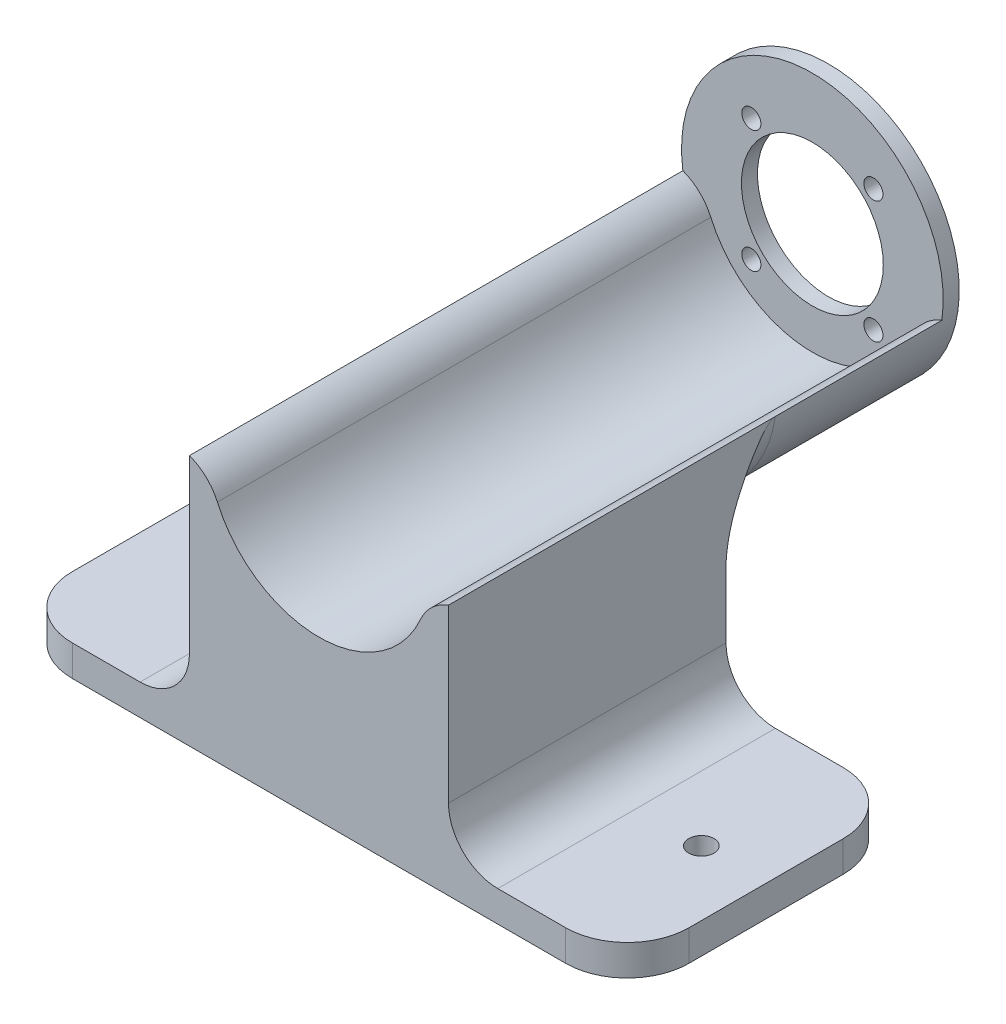
ISO-10303-21;
HEADER;
FILE_DESCRIPTION(('STEP AP214'),'2;1');
FILE_NAME('part.step','',(''),(''),'','','');
FILE_SCHEMA(('AUTOMOTIVE_DESIGN { 1 0 10303 214 1 1 1 1 }'));
ENDSEC;
DATA;
#1=APPLICATION_CONTEXT('core data for automotive mechanical design processes');
#2=APPLICATION_PROTOCOL_DEFINITION('international standard','automotive_design',2000,#1);
#3=PRODUCT_CONTEXT('',#1,'mechanical');
#4=PRODUCT('Part','Part','',(#3));
#5=PRODUCT_RELATED_PRODUCT_CATEGORY('part','',(#4));
#6=PRODUCT_DEFINITION_FORMATION('','',#4);
#7=PRODUCT_DEFINITION_CONTEXT('part definition',#1,'design');
#8=PRODUCT_DEFINITION('design','',#6,#7);
#9=PRODUCT_DEFINITION_SHAPE('','',#8);
#10=(LENGTH_UNIT() NAMED_UNIT(*) SI_UNIT(.MILLI.,.METRE.));
#11=(NAMED_UNIT(*) PLANE_ANGLE_UNIT() SI_UNIT($,.RADIAN.));
#12=(NAMED_UNIT(*) SI_UNIT($,.STERADIAN.) SOLID_ANGLE_UNIT());
#13=UNCERTAINTY_MEASURE_WITH_UNIT(LENGTH_MEASURE(1.E-05),#10,'distance_accuracy_value','');
#14=(GEOMETRIC_REPRESENTATION_CONTEXT(3) GLOBAL_UNCERTAINTY_ASSIGNED_CONTEXT((#13)) GLOBAL_UNIT_ASSIGNED_CONTEXT((#10,
#11,#12)) REPRESENTATION_CONTEXT('',''));
#15=CARTESIAN_POINT('',(0.,0.,0.));
#16=DIRECTION('',(0.,0.,1.));
#17=DIRECTION('',(1.,0.,0.));
#18=AXIS2_PLACEMENT_3D('',#15,#16,#17);
#19=CARTESIAN_POINT('',(9.9,51.1989898474541,-37.6));
#20=DIRECTION('',(0.,0.,1.));
#21=DIRECTION('',(1.,0.,0.));
#22=AXIS2_PLACEMENT_3D('',#19,#20,#21);
#23=CYLINDRICAL_SURFACE('',#22,1.55);
#24=CARTESIAN_POINT('',(9.9,51.1989898474541,-37.6));
#25=DIRECTION('',(0.,0.,-1.));
#26=DIRECTION('',(-1.,0.,0.));
#27=AXIS2_PLACEMENT_3D('',#24,#25,#26);
#28=CIRCLE('',#27,1.55);
#29=CARTESIAN_POINT('',(8.35,51.1989898474541,-37.6));
#30=VERTEX_POINT('',#29);
#31=EDGE_CURVE('E532',#30,#30,#28,.T.);
#32=ORIENTED_EDGE('',*,*,#31,.T.);
#33=EDGE_LOOP('',(#32));
#34=FACE_BOUND('',#33,.T.);
#35=CARTESIAN_POINT('',(9.9,51.1989898474541,-35.));
#36=DIRECTION('',(0.,0.,1.));
#37=DIRECTION('',(1.,0.,0.));
#38=AXIS2_PLACEMENT_3D('',#35,#36,#37);
#39=CIRCLE('',#38,1.55);
#40=CARTESIAN_POINT('',(11.45,51.1989898474541,-35.));
#41=VERTEX_POINT('',#40);
#42=EDGE_CURVE('E203',#41,#41,#39,.T.);
#43=ORIENTED_EDGE('',*,*,#42,.T.);
#44=EDGE_LOOP('',(#43));
#45=FACE_BOUND('',#44,.T.);
#46=ADVANCED_FACE('F41',(#34,#45),#23,.F.);
#47=CARTESIAN_POINT('',(-9.90000000000001,51.1989898474541,-37.6));
#48=DIRECTION('',(0.,0.,1.));
#49=DIRECTION('',(1.,0.,0.));
#50=AXIS2_PLACEMENT_3D('',#47,#48,#49);
#51=CYLINDRICAL_SURFACE('',#50,1.55);
#52=CARTESIAN_POINT('',(-9.90000000000001,51.1989898474541,-37.6));
#53=DIRECTION('',(0.,0.,-1.));
#54=DIRECTION('',(-1.,0.,0.));
#55=AXIS2_PLACEMENT_3D('',#52,#53,#54);
#56=CIRCLE('',#55,1.55);
#57=CARTESIAN_POINT('',(-11.45,51.1989898474541,-37.6));
#58=VERTEX_POINT('',#57);
#59=EDGE_CURVE('E536',#58,#58,#56,.T.);
#60=ORIENTED_EDGE('',*,*,#59,.T.);
#61=EDGE_LOOP('',(#60));
#62=FACE_BOUND('',#61,.T.);
#63=CARTESIAN_POINT('',(-9.90000000000001,51.1989898474541,-35.));
#64=DIRECTION('',(0.,0.,1.));
#65=DIRECTION('',(1.,0.,0.));
#66=AXIS2_PLACEMENT_3D('',#63,#64,#65);
#67=CIRCLE('',#66,1.55);
#68=CARTESIAN_POINT('',(-8.35,51.1989898474541,-35.));
#69=VERTEX_POINT('',#68);
#70=EDGE_CURVE('E552',#69,#69,#67,.T.);
#71=ORIENTED_EDGE('',*,*,#70,.T.);
#72=EDGE_LOOP('',(#71));
#73=FACE_BOUND('',#72,.T.);
#74=ADVANCED_FACE('F278',(#62,#73),#51,.F.);
#75=CARTESIAN_POINT('',(-9.90000000000001,31.3989898474541,-37.6));
#76=DIRECTION('',(0.,0.,1.));
#77=DIRECTION('',(1.,0.,0.));
#78=AXIS2_PLACEMENT_3D('',#75,#76,#77);
#79=CYLINDRICAL_SURFACE('',#78,1.55);
#80=CARTESIAN_POINT('',(-9.90000000000001,31.3989898474541,-37.6));
#81=DIRECTION('',(0.,0.,-1.));
#82=DIRECTION('',(-1.,0.,0.));
#83=AXIS2_PLACEMENT_3D('',#80,#81,#82);
#84=CIRCLE('',#83,1.55);
#85=CARTESIAN_POINT('',(-11.45,31.3989898474541,-37.6));
#86=VERTEX_POINT('',#85);
#87=EDGE_CURVE('E540',#86,#86,#84,.T.);
#88=ORIENTED_EDGE('',*,*,#87,.T.);
#89=EDGE_LOOP('',(#88));
#90=FACE_BOUND('',#89,.T.);
#91=CARTESIAN_POINT('',(-9.90000000000001,31.3989898474541,-35.));
#92=DIRECTION('',(0.,0.,1.));
#93=DIRECTION('',(1.,0.,0.));
#94=AXIS2_PLACEMENT_3D('',#91,#92,#93);
#95=CIRCLE('',#94,1.55);
#96=CARTESIAN_POINT('',(-8.35000000000001,31.3989898474541,-35.));
#97=VERTEX_POINT('',#96);
#98=EDGE_CURVE('E388',#97,#97,#95,.T.);
#99=ORIENTED_EDGE('',*,*,#98,.T.);
#100=EDGE_LOOP('',(#99));
#101=FACE_BOUND('',#100,.T.);
#102=ADVANCED_FACE('F284',(#90,#101),#79,.F.);
#103=CARTESIAN_POINT('',(9.9,31.3989898474541,-37.6));
#104=DIRECTION('',(0.,0.,1.));
#105=DIRECTION('',(1.,0.,0.));
#106=AXIS2_PLACEMENT_3D('',#103,#104,#105);
#107=CYLINDRICAL_SURFACE('',#106,1.55);
#108=CARTESIAN_POINT('',(9.9,31.3989898474541,-37.6));
#109=DIRECTION('',(0.,0.,-1.));
#110=DIRECTION('',(-1.,0.,0.));
#111=AXIS2_PLACEMENT_3D('',#108,#109,#110);
#112=CIRCLE('',#111,1.55);
#113=CARTESIAN_POINT('',(8.35,31.3989898474541,-37.6));
#114=VERTEX_POINT('',#113);
#115=EDGE_CURVE('E202',#114,#114,#112,.T.);
#116=ORIENTED_EDGE('',*,*,#115,.T.);
#117=EDGE_LOOP('',(#116));
#118=FACE_BOUND('',#117,.T.);
#119=CARTESIAN_POINT('',(9.9,31.3989898474541,-35.));
#120=DIRECTION('',(0.,0.,1.));
#121=DIRECTION('',(1.,0.,0.));
#122=AXIS2_PLACEMENT_3D('',#119,#120,#121);
#123=CIRCLE('',#122,1.55);
#124=CARTESIAN_POINT('',(11.45,31.3989898474541,-35.));
#125=VERTEX_POINT('',#124);
#126=EDGE_CURVE('E385',#125,#125,#123,.T.);
#127=ORIENTED_EDGE('',*,*,#126,.T.);
#128=EDGE_LOOP('',(#127));
#129=FACE_BOUND('',#128,.T.);
#130=ADVANCED_FACE('F241',(#118,#129),#107,.F.);
#131=CARTESIAN_POINT('',(21.,2.5,45.));
#132=DIRECTION('',(0.,-1.,0.));
#133=DIRECTION('',(0.,0.,-1.));
#134=AXIS2_PLACEMENT_3D('',#131,#132,#133);
#135=PLANE('',#134);
#136=CARTESIAN_POINT('',(39.5,2.5,22.5));
#137=DIRECTION('',(0.,1.,0.));
#138=DIRECTION('',(0.,0.,-1.));
#139=AXIS2_PLACEMENT_3D('',#136,#137,#138);
#140=CIRCLE('',#139,2.05);
#141=CARTESIAN_POINT('',(39.5,2.5,20.45));
#142=VERTEX_POINT('',#141);
#143=EDGE_CURVE('E497',#142,#142,#140,.T.);
#144=ORIENTED_EDGE('',*,*,#143,.F.);
#145=EDGE_LOOP('',(#144));
#146=FACE_BOUND('',#145,.T.);
#147=DIRECTION('',(-1.,0.,0.));
#148=VECTOR('',#147,1.);
#149=CARTESIAN_POINT('',(21.,2.5,0.));
#150=LINE('',#149,#148);
#151=CARTESIAN_POINT('',(40.,2.5,0.));
#152=VERTEX_POINT('',#151);
#153=CARTESIAN_POINT('',(29.,2.5,0.));
#154=VERTEX_POINT('',#153);
#155=EDGE_CURVE('E424',#152,#154,#150,.T.);
#156=ORIENTED_EDGE('',*,*,#155,.T.);
#157=DIRECTION('',(0.,0.,-1.));
#158=VECTOR('',#157,1.);
#159=CARTESIAN_POINT('',(29.,2.5,45.));
#160=LINE('',#159,#158);
#161=CARTESIAN_POINT('',(29.,2.5,45.));
#162=VERTEX_POINT('',#161);
#163=EDGE_CURVE('E363',#154,#162,#160,.F.);
#164=ORIENTED_EDGE('',*,*,#163,.T.);
#165=DIRECTION('',(-1.,0.,0.));
#166=VECTOR('',#165,1.);
#167=CARTESIAN_POINT('',(21.,2.5,45.));
#168=LINE('',#167,#166);
#169=CARTESIAN_POINT('',(40.,2.5,45.));
#170=VERTEX_POINT('',#169);
#171=EDGE_CURVE('E431',#170,#162,#168,.T.);
#172=ORIENTED_EDGE('',*,*,#171,.F.);
#173=CARTESIAN_POINT('',(40.,2.5,35.));
#174=DIRECTION('',(0.,-1.,0.));
#175=DIRECTION('',(0.,0.,-1.));
#176=AXIS2_PLACEMENT_3D('',#173,#174,#175);
#177=CIRCLE('',#176,10.);
#178=CARTESIAN_POINT('',(50.,2.5,35.));
#179=VERTEX_POINT('',#178);
#180=EDGE_CURVE('E453',#170,#179,#177,.F.);
#181=ORIENTED_EDGE('',*,*,#180,.T.);
#182=DIRECTION('',(0.,0.,-1.));
#183=VECTOR('',#182,1.);
#184=CARTESIAN_POINT('',(50.,2.5,45.));
#185=LINE('',#184,#183);
#186=CARTESIAN_POINT('',(50.,2.5,10.));
#187=VERTEX_POINT('',#186);
#188=EDGE_CURVE('E432',#179,#187,#185,.T.);
#189=ORIENTED_EDGE('',*,*,#188,.T.);
#190=CARTESIAN_POINT('',(40.,2.5,10.));
#191=DIRECTION('',(0.,-1.,0.));
#192=DIRECTION('',(0.,0.,-1.));
#193=AXIS2_PLACEMENT_3D('',#190,#191,#192);
#194=CIRCLE('',#193,10.);
#195=EDGE_CURVE('E456',#187,#152,#194,.F.);
#196=ORIENTED_EDGE('',*,*,#195,.T.);
#197=EDGE_LOOP('',(#156,#164,#172,#181,#189,#196));
#198=FACE_BOUND('',#197,.T.);
#199=ADVANCED_FACE('F237',(#146,#198),#135,.F.);
#200=CARTESIAN_POINT('',(21.,38.3,45.));
#201=DIRECTION('',(-1.,0.,0.));
#202=DIRECTION('',(0.,-1.,0.));
#203=AXIS2_PLACEMENT_3D('',#200,#201,#202);
#204=PLANE('',#203);
#205=DIRECTION('',(0.,1.,0.));
#206=VECTOR('',#205,1.);
#207=CARTESIAN_POINT('',(21.,38.3,45.));
#208=LINE('',#207,#206);
#209=CARTESIAN_POINT('',(21.,10.5,45.));
#210=VERTEX_POINT('',#209);
#211=CARTESIAN_POINT('',(21.,38.3,45.));
#212=VERTEX_POINT('',#211);
#213=EDGE_CURVE('E404',#210,#212,#208,.T.);
#214=ORIENTED_EDGE('',*,*,#213,.F.);
#215=DIRECTION('',(0.,0.,-1.));
#216=VECTOR('',#215,1.);
#217=CARTESIAN_POINT('',(21.,10.5,0.));
#218=LINE('',#217,#216);
#219=CARTESIAN_POINT('',(21.,10.5,0.));
#220=VERTEX_POINT('',#219);
#221=EDGE_CURVE('E359',#210,#220,#218,.T.);
#222=ORIENTED_EDGE('',*,*,#221,.T.);
#223=DIRECTION('',(0.,1.,0.));
#224=VECTOR('',#223,1.);
#225=CARTESIAN_POINT('',(21.,38.3,0.));
#226=LINE('',#225,#224);
#227=CARTESIAN_POINT('',(21.,20.9920888575525,0.));
#228=VERTEX_POINT('',#227);
#229=EDGE_CURVE('E412',#220,#228,#226,.T.);
#230=ORIENTED_EDGE('',*,*,#229,.T.);
#231=CARTESIAN_POINT('',(21.,20.9920888575525,0.));
#232=CARTESIAN_POINT('',(21.,21.2623409261324,-6.71861428184681E-06));
#233=CARTESIAN_POINT('',(21.,21.5325275202442,-0.00661704058536909));
#234=CARTESIAN_POINT('',(21.,22.0722317970235,-0.0322618663273328));
#235=CARTESIAN_POINT('',(21.,22.3417496620315,-0.0512924945656515));
#236=CARTESIAN_POINT('',(21.,23.147717395016,-0.125752491028399));
#237=CARTESIAN_POINT('',(21.,23.6826185956186,-0.198556053612414));
#238=CARTESIAN_POINT('',(21.,24.7442450465604,-0.384595417943144));
#239=CARTESIAN_POINT('',(21.,25.2709819497984,-0.497766714324408));
#240=CARTESIAN_POINT('',(21.,26.3157953901878,-0.759484195902259));
#241=CARTESIAN_POINT('',(21.,26.8338677402384,-0.908046983731396));
#242=CARTESIAN_POINT('',(21.,27.7165912449188,-1.19012251426909));
#243=CARTESIAN_POINT('',(21.,28.0836452323154,-1.31623276224073));
#244=CARTESIAN_POINT('',(21.,28.8124454857969,-1.58296288509404));
#245=CARTESIAN_POINT('',(21.,29.1741916936457,-1.72358291903872));
#246=CARTESIAN_POINT('',(21.,29.8924872145569,-2.01810446595665));
#247=CARTESIAN_POINT('',(21.,30.2490330630773,-2.17201439915696));
#248=CARTESIAN_POINT('',(21.,30.9566303944847,-2.49191991078786));
#249=CARTESIAN_POINT('',(21.,31.3076821363394,-2.65791491748486));
#250=CARTESIAN_POINT('',(21.,32.0041355626901,-3.00107787409831));
#251=CARTESIAN_POINT('',(21.,32.3495390195583,-3.17824223104802));
#252=CARTESIAN_POINT('',(21.,33.0346714898339,-3.54329852451233));
#253=CARTESIAN_POINT('',(21.,33.3743998901954,-3.73119161043082));
#254=CARTESIAN_POINT('',(21.,34.0474288293915,-4.11753368676009));
#255=CARTESIAN_POINT('',(21.,34.380734741634,-4.31597327985377));
#256=CARTESIAN_POINT('',(21.,34.8751733043352,-4.62244912915646));
#257=CARTESIAN_POINT('',(21.,35.0390527208008,-4.72606818010602));
#258=CARTESIAN_POINT('',(21.,35.3646921479181,-4.93657973434685));
#259=CARTESIAN_POINT('',(21.,35.5264522683963,-5.04347206704386));
#260=CARTESIAN_POINT('',(21.,35.7907084150292,-5.22261514762113));
#261=CARTESIAN_POINT('',(21.,35.8939524830505,-5.29376317336676));
#262=CARTESIAN_POINT('',(21.,36.0991798109869,-5.437863857316));
#263=CARTESIAN_POINT('',(21.,36.2011630434743,-5.51081655467476));
#264=CARTESIAN_POINT('',(21.,36.4037276822896,-5.6589082938422));
#265=CARTESIAN_POINT('',(21.,36.5043071894743,-5.73404993947667));
#266=CARTESIAN_POINT('',(21.,36.7035336167251,-5.88683736377596));
#267=CARTESIAN_POINT('',(21.,36.8021807801776,-5.96448282377288));
#268=CARTESIAN_POINT('',(21.,36.9921317414153,-6.11895236583142));
#269=CARTESIAN_POINT('',(21.,37.0835571239362,-6.19562628525305));
#270=CARTESIAN_POINT('',(21.,37.2633235468887,-6.35250107066562));
#271=CARTESIAN_POINT('',(21.,37.3516652092276,-6.43270121804817));
#272=CARTESIAN_POINT('',(21.,37.5239262991856,-6.59765902437491));
#273=CARTESIAN_POINT('',(21.,37.607848304476,-6.68241396721882));
#274=CARTESIAN_POINT('',(21.,37.7690197278868,-6.85798231932057));
#275=CARTESIAN_POINT('',(21.,37.8462780503733,-6.94878734706603));
#276=CARTESIAN_POINT('',(21.,37.9736132494437,-7.1169665429816));
#277=CARTESIAN_POINT('',(21.,38.0258658884497,-7.19266381049547));
#278=CARTESIAN_POINT('',(21.,38.1203384004898,-7.34952721477898));
#279=CARTESIAN_POINT('',(21.,38.1626272641338,-7.43065043036103));
#280=CARTESIAN_POINT('',(21.,38.2292092461585,-7.59097093670216));
#281=CARTESIAN_POINT('',(21.,38.2548636670585,-7.66957227889538));
#282=CARTESIAN_POINT('',(21.,38.2814618042968,-7.79090027867671));
#283=CARTESIAN_POINT('',(21.,38.2883542135568,-7.83234050720433));
#284=CARTESIAN_POINT('',(21.,38.2976483166263,-7.91583835676566));
#285=CARTESIAN_POINT('',(21.,38.3000369297868,-7.95789741969281));
#286=CARTESIAN_POINT('',(21.,38.3,-7.99999999999999));
#287=B_SPLINE_CURVE_WITH_KNOTS('',3,(#231,#232,#233,#234,#235,#236,#237,#238,#239,#240,#241,
#242,#243,#244,#245,#246,#247,#248,#249,#250,#251,#252,#253,#254,#255,#256,#257,#258,#259,#260,
#261,#262,#263,#264,#265,#266,#267,#268,#269,#270,#271,#272,#273,#274,#275,#276,#277,#278,#279,
#280,#281,#282,#283,#284,#285,#286),.UNSPECIFIED.,.F.,.F.,(4,2,2,2,2,2,2,2,2,2,2,2,2,2,2,2,2,2,
2,2,2,2,2,2,2,2,2,4),(0.,0.810566074257809,1.62087934683629,3.23840542011351,4.8533582724729,
6.469070218352,7.63311416540261,8.79717087459991,9.96197059687528,11.1267152493218,
12.2910871187291,13.4555839660132,14.6190600550503,15.2007014551309,15.7823125931134,
16.1584519252524,16.5345994254851,16.9112142735377,17.2877813764288,17.64567716984,
18.0035003628532,18.3611124978091,18.7182391198544,18.9937023186833,19.2671981027941,
19.5137823076149,19.639583153034,19.7657488100534),.UNSPECIFIED.);
#288=CARTESIAN_POINT('',(21.,38.3,-8.));
#289=VERTEX_POINT('',#288);
#290=EDGE_CURVE('E11',#228,#289,#287,.T.);
#291=ORIENTED_EDGE('',*,*,#290,.T.);
#292=DIRECTION('',(0.,0.,-1.));
#293=VECTOR('',#292,1.);
#294=CARTESIAN_POINT('',(21.,38.3,45.));
#295=LINE('',#294,#293);
#296=EDGE_CURVE('E63',#212,#289,#295,.T.);
#297=ORIENTED_EDGE('',*,*,#296,.F.);
#298=EDGE_LOOP('',(#214,#222,#230,#291,#297));
#299=FACE_BOUND('',#298,.T.);
#300=ADVANCED_FACE('F233',(#299),#204,.F.);
#301=CARTESIAN_POINT('',(0.,41.3,45.));
#302=DIRECTION('',(0.,0.,-1.));
#303=DIRECTION('',(-1.,0.,0.));
#304=AXIS2_PLACEMENT_3D('',#301,#302,#303);
#305=CYLINDRICAL_SURFACE('',#304,18.);
#306=CARTESIAN_POINT('',(0.,41.3,45.));
#307=DIRECTION('',(0.,0.,-1.));
#308=DIRECTION('',(1.,0.,0.));
#309=AXIS2_PLACEMENT_3D('',#306,#307,#308);
#310=CIRCLE('',#309,18.);
#311=CARTESIAN_POINT('',(16.4671040203401,34.0312666039194,45.));
#312=VERTEX_POINT('',#311);
#313=CARTESIAN_POINT('',(-16.4671040203401,34.0312666039194,45.));
#314=VERTEX_POINT('',#313);
#315=EDGE_CURVE('E402',#312,#314,#310,.T.);
#316=ORIENTED_EDGE('',*,*,#315,.F.);
#317=DIRECTION('',(0.,0.,-1.));
#318=VECTOR('',#317,1.);
#319=CARTESIAN_POINT('',(16.4671040203401,34.0312666039194,45.));
#320=LINE('',#319,#318);
#321=CARTESIAN_POINT('',(16.4671040203401,34.0312666039194,-35.));
#322=VERTEX_POINT('',#321);
#323=EDGE_CURVE('E395',#312,#322,#320,.T.);
#324=ORIENTED_EDGE('',*,*,#323,.T.);
#325=CARTESIAN_POINT('',(0.,41.3,-35.));
#326=DIRECTION('',(0.,0.,1.));
#327=DIRECTION('',(1.,0.,0.));
#328=AXIS2_PLACEMENT_3D('',#325,#326,#327);
#329=CIRCLE('',#328,18.);
#330=CARTESIAN_POINT('',(-16.4671040203401,34.0312666039194,-35.));
#331=VERTEX_POINT('',#330);
#332=EDGE_CURVE('E389',#331,#322,#329,.T.);
#333=ORIENTED_EDGE('',*,*,#332,.F.);
#334=DIRECTION('',(0.,0.,-1.));
#335=VECTOR('',#334,1.);
#336=CARTESIAN_POINT('',(-16.4671040203401,34.0312666039194,45.));
#337=LINE('',#336,#335);
#338=EDGE_CURVE('E87',#331,#314,#337,.F.);
#339=ORIENTED_EDGE('',*,*,#338,.T.);
#340=EDGE_LOOP('',(#316,#324,#333,#339));
#341=FACE_BOUND('',#340,.T.);
#342=ADVANCED_FACE('F230',(#341),#305,.F.);
#343=CARTESIAN_POINT('',(-21.,38.3,45.));
#344=DIRECTION('',(1.,0.,0.));
#345=DIRECTION('',(0.,1.,0.));
#346=AXIS2_PLACEMENT_3D('',#343,#344,#345);
#347=PLANE('',#346);
#348=DIRECTION('',(0.,0.,-1.));
#349=VECTOR('',#348,1.);
#350=CARTESIAN_POINT('',(-21.,38.3,45.));
#351=LINE('',#350,#349);
#352=CARTESIAN_POINT('',(-21.,38.3,45.));
#353=VERTEX_POINT('',#352);
#354=CARTESIAN_POINT('',(-21.,38.3,-7.99999999999997));
#355=VERTEX_POINT('',#354);
#356=EDGE_CURVE('E80',#353,#355,#351,.T.);
#357=ORIENTED_EDGE('',*,*,#356,.T.);
#358=CARTESIAN_POINT('',(-21.,38.3,-7.99999999999999));
#359=CARTESIAN_POINT('',(-21.,38.3000294715128,-7.96014574527285));
#360=CARTESIAN_POINT('',(-21.,38.2978924391978,-7.92032462424123));
#361=CARTESIAN_POINT('',(-21.,38.2895540261075,-7.84120955724019));
#362=CARTESIAN_POINT('',(-21.,38.2833630637864,-7.80191452269677));
#363=CARTESIAN_POINT('',(-21.,38.2594595360832,-7.68696322757637));
#364=CARTESIAN_POINT('',(-21.,38.2363900550809,-7.61240757705492));
#365=CARTESIAN_POINT('',(-21.,38.1669419150202,-7.43654995492678));
#366=CARTESIAN_POINT('',(-21.,38.1147986289761,-7.3376116991071));
#367=CARTESIAN_POINT('',(-21.,38.0262227313502,-7.19534515547018));
#368=CARTESIAN_POINT('',(-21.,37.9947491464823,-7.14868446293534));
#369=CARTESIAN_POINT('',(-21.,37.9290790927893,-7.05732286380408));
#370=CARTESIAN_POINT('',(-21.,37.8948835440236,-7.01262130285086));
#371=CARTESIAN_POINT('',(-21.,37.7872932625618,-6.8787803608284));
#372=CARTESIAN_POINT('',(-21.,37.7105153717932,-6.79237898857144));
#373=CARTESIAN_POINT('',(-21.,37.5513231669407,-6.62488963771451));
#374=CARTESIAN_POINT('',(-21.,37.4689029105879,-6.54380744256202));
#375=CARTESIAN_POINT('',(-21.,37.2999930647518,-6.38547957233894));
#376=CARTESIAN_POINT('',(-21.,37.213491496122,-6.30824676059909));
#377=CARTESIAN_POINT('',(-21.,37.0377270187304,-6.15697744383895));
#378=CARTESIAN_POINT('',(-21.,36.9484635028672,-6.08294165024388));
#379=CARTESIAN_POINT('',(-21.,36.6762621641949,-5.86355431791045));
#380=CARTESIAN_POINT('',(-21.,36.4901978339409,-5.72208307130622));
#381=CARTESIAN_POINT('',(-21.,36.207431320439,-5.51542027522806));
#382=CARTESIAN_POINT('',(-21.,36.1126632326854,-5.44752350449733));
#383=CARTESIAN_POINT('',(-21.,35.9220126413134,-5.31331076972259));
#384=CARTESIAN_POINT('',(-21.,35.8261301595158,-5.24699477480307));
#385=CARTESIAN_POINT('',(-21.,35.5374411157787,-5.05038721574794));
#386=CARTESIAN_POINT('',(-21.,35.3432229778667,-4.92216819873273));
#387=CARTESIAN_POINT('',(-21.,34.9517960911423,-4.67036317244351));
#388=CARTESIAN_POINT('',(-21.,34.7545870929393,-4.5467775525384));
#389=CARTESIAN_POINT('',(-21.,34.3575640421912,-4.30373828923131));
#390=CARTESIAN_POINT('',(-21.,34.1577492698494,-4.18428582231387));
#391=CARTESIAN_POINT('',(-21.,33.7558192863551,-3.94931199853993));
#392=CARTESIAN_POINT('',(-21.,33.5537040064054,-3.83379075966191));
#393=CARTESIAN_POINT('',(-21.,32.9432661323346,-3.49247828726332));
#394=CARTESIAN_POINT('',(-21.,32.5316988749827,-3.27245496080963));
#395=CARTESIAN_POINT('',(-21.,31.7005882539882,-2.84823162047843));
#396=CARTESIAN_POINT('',(-21.,31.2810463522524,-2.64402874058942));
#397=CARTESIAN_POINT('',(-21.,30.4386234762605,-2.25485083695608));
#398=CARTESIAN_POINT('',(-21.,30.015827928904,-2.0696914582035));
#399=CARTESIAN_POINT('',(-21.,29.1625118140953,-1.7179049420968));
#400=CARTESIAN_POINT('',(-21.,28.7319903836745,-1.55127989014966));
#401=CARTESIAN_POINT('',(-21.,27.8642413169849,-1.2391022705398));
#402=CARTESIAN_POINT('',(-21.,27.4270275795099,-1.09351124259141));
#403=CARTESIAN_POINT('',(-21.,26.5455350207955,-0.825619523372688));
#404=CARTESIAN_POINT('',(-21.,26.1012572295256,-0.703315469896112));
#405=CARTESIAN_POINT('',(-21.,25.2740264266697,-0.501418277216773));
#406=CARTESIAN_POINT('',(-21.,24.8919693920506,-0.418162400292971));
#407=CARTESIAN_POINT('',(-21.,24.1239223225993,-0.272472187729207));
#408=CARTESIAN_POINT('',(-21.,23.737932788311,-0.21003523547038));
#409=CARTESIAN_POINT('',(-21.,22.9596922109545,-0.10766704197312));
#410=CARTESIAN_POINT('',(-21.,22.5674157787888,-0.0679249626381231));
#411=CARTESIAN_POINT('',(-21.,21.7808460795722,-0.0140950550414596));
#412=CARTESIAN_POINT('',(-21.,21.3865515582791,-2.58155306761613E-05));
#413=CARTESIAN_POINT('',(-21.,20.9920888575525,0.));
#414=B_SPLINE_CURVE_WITH_KNOTS('',3,(#358,#359,#360,#361,#362,#363,#364,#365,#366,#367,#368,
#369,#370,#371,#372,#373,#374,#375,#376,#377,#378,#379,#380,#381,#382,#383,#384,#385,#386,#387,
#388,#389,#390,#391,#392,#393,#394,#395,#396,#397,#398,#399,#400,#401,#402,#403,#404,#405,#406,
#407,#408,#409,#410,#411,#412,#413),.UNSPECIFIED.,.F.,.F.,(4,2,2,2,2,2,2,2,2,2,2,2,2,2,2,2,2,2,
2,2,2,2,2,2,2,2,2,4),(0.,0.119448916588933,0.23859205224717,0.471478462540571,0.804998088199718,
0.973803168733794,1.14255143127349,1.48887454754084,1.83556817885894,2.18335180183337,
2.53121242163767,3.23211742304177,3.58185314788167,3.93158203612107,4.62967008436581,
5.32781666575167,6.02616036359743,6.72452500069895,8.12422974199269,9.52368031877758,
10.9079684121711,12.2924121028084,13.6742914279148,15.0559710837888,16.2285242723939,
17.4009300334858,18.5829702892218,19.7658660773583),.UNSPECIFIED.);
#415=CARTESIAN_POINT('',(-21.,20.9920888575525,0.));
#416=VERTEX_POINT('',#415);
#417=EDGE_CURVE('E56',#355,#416,#414,.T.);
#418=ORIENTED_EDGE('',*,*,#417,.T.);
#419=DIRECTION('',(0.,-1.,0.));
#420=VECTOR('',#419,1.);
#421=CARTESIAN_POINT('',(-21.,38.3,0.));
#422=LINE('',#421,#420);
#423=CARTESIAN_POINT('',(-21.,10.5,0.));
#424=VERTEX_POINT('',#423);
#425=EDGE_CURVE('E414',#416,#424,#422,.T.);
#426=ORIENTED_EDGE('',*,*,#425,.T.);
#427=DIRECTION('',(0.,0.,-1.));
#428=VECTOR('',#427,1.);
#429=CARTESIAN_POINT('',(-21.,10.5,45.));
#430=LINE('',#429,#428);
#431=CARTESIAN_POINT('',(-21.,10.5,45.));
#432=VERTEX_POINT('',#431);
#433=EDGE_CURVE('E370',#424,#432,#430,.F.);
#434=ORIENTED_EDGE('',*,*,#433,.T.);
#435=DIRECTION('',(0.,-1.,0.));
#436=VECTOR('',#435,1.);
#437=CARTESIAN_POINT('',(-21.,38.3,45.));
#438=LINE('',#437,#436);
#439=EDGE_CURVE('E407',#353,#432,#438,.T.);
#440=ORIENTED_EDGE('',*,*,#439,.F.);
#441=EDGE_LOOP('',(#357,#418,#426,#434,#440));
#442=FACE_BOUND('',#441,.T.);
#443=ADVANCED_FACE('F224',(#442),#347,.F.);
#444=CARTESIAN_POINT('',(-50.,2.5,45.));
#445=DIRECTION('',(0.,-1.,0.));
#446=DIRECTION('',(0.,0.,-1.));
#447=AXIS2_PLACEMENT_3D('',#444,#445,#446);
#448=PLANE('',#447);
#449=CARTESIAN_POINT('',(-39.5,2.5,22.5));
#450=DIRECTION('',(0.,1.,0.));
#451=DIRECTION('',(0.,0.,1.));
#452=AXIS2_PLACEMENT_3D('',#449,#450,#451);
#453=CIRCLE('',#452,2.05);
#454=CARTESIAN_POINT('',(-39.5,2.5,24.55));
#455=VERTEX_POINT('',#454);
#456=EDGE_CURVE('E512',#455,#455,#453,.T.);
#457=ORIENTED_EDGE('',*,*,#456,.F.);
#458=EDGE_LOOP('',(#457));
#459=FACE_BOUND('',#458,.T.);
#460=DIRECTION('',(-1.,0.,0.));
#461=VECTOR('',#460,1.);
#462=CARTESIAN_POINT('',(-50.,2.5,45.));
#463=LINE('',#462,#461);
#464=CARTESIAN_POINT('',(-29.,2.5,45.));
#465=VERTEX_POINT('',#464);
#466=CARTESIAN_POINT('',(-40.,2.5,45.));
#467=VERTEX_POINT('',#466);
#468=EDGE_CURVE('E503',#465,#467,#463,.T.);
#469=ORIENTED_EDGE('',*,*,#468,.F.);
#470=DIRECTION('',(0.,0.,-1.));
#471=VECTOR('',#470,1.);
#472=CARTESIAN_POINT('',(-29.,2.5,0.));
#473=LINE('',#472,#471);
#474=CARTESIAN_POINT('',(-29.,2.5,0.));
#475=VERTEX_POINT('',#474);
#476=EDGE_CURVE('E366',#465,#475,#473,.T.);
#477=ORIENTED_EDGE('',*,*,#476,.T.);
#478=DIRECTION('',(-1.,0.,0.));
#479=VECTOR('',#478,1.);
#480=CARTESIAN_POINT('',(-50.,2.5,0.));
#481=LINE('',#480,#479);
#482=CARTESIAN_POINT('',(-40.,2.5,0.));
#483=VERTEX_POINT('',#482);
#484=EDGE_CURVE('E418',#475,#483,#481,.T.);
#485=ORIENTED_EDGE('',*,*,#484,.T.);
#486=CARTESIAN_POINT('',(-40.,2.5,10.));
#487=DIRECTION('',(0.,-1.,0.));
#488=DIRECTION('',(0.,0.,-1.));
#489=AXIS2_PLACEMENT_3D('',#486,#487,#488);
#490=CIRCLE('',#489,10.);
#491=CARTESIAN_POINT('',(-50.,2.5,10.));
#492=VERTEX_POINT('',#491);
#493=EDGE_CURVE('E348',#483,#492,#490,.F.);
#494=ORIENTED_EDGE('',*,*,#493,.T.);
#495=DIRECTION('',(0.,0.,-1.));
#496=VECTOR('',#495,1.);
#497=CARTESIAN_POINT('',(-50.,2.5,45.));
#498=LINE('',#497,#496);
#499=CARTESIAN_POINT('',(-50.,2.5,35.));
#500=VERTEX_POINT('',#499);
#501=EDGE_CURVE('E338',#500,#492,#498,.T.);
#502=ORIENTED_EDGE('',*,*,#501,.F.);
#503=CARTESIAN_POINT('',(-40.,2.5,35.));
#504=DIRECTION('',(0.,-1.,0.));
#505=DIRECTION('',(0.,0.,-1.));
#506=AXIS2_PLACEMENT_3D('',#503,#504,#505);
#507=CIRCLE('',#506,10.);
#508=EDGE_CURVE('E346',#500,#467,#507,.F.);
#509=ORIENTED_EDGE('',*,*,#508,.T.);
#510=EDGE_LOOP('',(#469,#477,#485,#494,#502,#509));
#511=FACE_BOUND('',#510,.T.);
#512=ADVANCED_FACE('F229',(#459,#511),#448,.F.);
#513=CARTESIAN_POINT('',(-50.,-2.5,45.));
#514=DIRECTION('',(1.,0.,0.));
#515=DIRECTION('',(0.,0.,-1.));
#516=AXIS2_PLACEMENT_3D('',#513,#514,#515);
#517=PLANE('',#516);
#518=DIRECTION('',(0.,0.,-1.));
#519=VECTOR('',#518,1.);
#520=CARTESIAN_POINT('',(-50.,-2.5,45.));
#521=LINE('',#520,#519);
#522=CARTESIAN_POINT('',(-50.,-2.5,35.));
#523=VERTEX_POINT('',#522);
#524=CARTESIAN_POINT('',(-50.,-2.5,10.));
#525=VERTEX_POINT('',#524);
#526=EDGE_CURVE('E329',#523,#525,#521,.T.);
#527=ORIENTED_EDGE('',*,*,#526,.F.);
#528=DIRECTION('',(0.,-1.,0.));
#529=VECTOR('',#528,1.);
#530=CARTESIAN_POINT('',(-50.,2.5,35.));
#531=LINE('',#530,#529);
#532=EDGE_CURVE('E332',#523,#500,#531,.F.);
#533=ORIENTED_EDGE('',*,*,#532,.T.);
#534=ORIENTED_EDGE('',*,*,#501,.T.);
#535=DIRECTION('',(0.,-1.,0.));
#536=VECTOR('',#535,1.);
#537=CARTESIAN_POINT('',(-50.,-2.5,10.));
#538=LINE('',#537,#536);
#539=EDGE_CURVE('E335',#492,#525,#538,.T.);
#540=ORIENTED_EDGE('',*,*,#539,.T.);
#541=EDGE_LOOP('',(#527,#533,#534,#540));
#542=FACE_BOUND('',#541,.T.);
#543=ADVANCED_FACE('F318',(#542),#517,.F.);
#544=CARTESIAN_POINT('',(-50.,-2.5,45.));
#545=DIRECTION('',(0.,1.,0.));
#546=DIRECTION('',(0.,0.,1.));
#547=AXIS2_PLACEMENT_3D('',#544,#545,#546);
#548=PLANE('',#547);
#549=CARTESIAN_POINT('',(-39.5,-2.5,22.5));
#550=DIRECTION('',(0.,1.,0.));
#551=DIRECTION('',(0.,0.,1.));
#552=AXIS2_PLACEMENT_3D('',#549,#550,#551);
#553=CIRCLE('',#552,2.05);
#554=CARTESIAN_POINT('',(-39.5,-2.5,24.55));
#555=VERTEX_POINT('',#554);
#556=EDGE_CURVE('E508',#555,#555,#553,.T.);
#557=ORIENTED_EDGE('',*,*,#556,.T.);
#558=EDGE_LOOP('',(#557));
#559=FACE_BOUND('',#558,.T.);
#560=CARTESIAN_POINT('',(39.5,-2.5,22.5));
#561=DIRECTION('',(0.,1.,0.));
#562=DIRECTION('',(0.,0.,-1.));
#563=AXIS2_PLACEMENT_3D('',#560,#561,#562);
#564=CIRCLE('',#563,2.05);
#565=CARTESIAN_POINT('',(39.5,-2.5,20.45));
#566=VERTEX_POINT('',#565);
#567=EDGE_CURVE('E517',#566,#566,#564,.T.);
#568=ORIENTED_EDGE('',*,*,#567,.T.);
#569=EDGE_LOOP('',(#568));
#570=FACE_BOUND('',#569,.T.);
#571=DIRECTION('',(1.,0.,0.));
#572=VECTOR('',#571,1.);
#573=CARTESIAN_POINT('',(-50.,-2.5,0.));
#574=LINE('',#573,#572);
#575=CARTESIAN_POINT('',(-40.,-2.5,0.));
#576=VERTEX_POINT('',#575);
#577=CARTESIAN_POINT('',(40.,-2.5,0.));
#578=VERTEX_POINT('',#577);
#579=EDGE_CURVE('E422',#576,#578,#574,.T.);
#580=ORIENTED_EDGE('',*,*,#579,.T.);
#581=CARTESIAN_POINT('',(40.,-2.5,10.));
#582=DIRECTION('',(0.,1.,0.));
#583=DIRECTION('',(0.,0.,1.));
#584=AXIS2_PLACEMENT_3D('',#581,#582,#583);
#585=CIRCLE('',#584,10.);
#586=CARTESIAN_POINT('',(50.,-2.5,10.));
#587=VERTEX_POINT('',#586);
#588=EDGE_CURVE('E474',#578,#587,#585,.F.);
#589=ORIENTED_EDGE('',*,*,#588,.T.);
#590=DIRECTION('',(0.,0.,-1.));
#591=VECTOR('',#590,1.);
#592=CARTESIAN_POINT('',(50.,-2.5,45.));
#593=LINE('',#592,#591);
#594=CARTESIAN_POINT('',(50.,-2.5,35.));
#595=VERTEX_POINT('',#594);
#596=EDGE_CURVE('E339',#595,#587,#593,.T.);
#597=ORIENTED_EDGE('',*,*,#596,.F.);
#598=CARTESIAN_POINT('',(40.,-2.5,35.));
#599=DIRECTION('',(0.,1.,0.));
#600=DIRECTION('',(0.,0.,1.));
#601=AXIS2_PLACEMENT_3D('',#598,#599,#600);
#602=CIRCLE('',#601,10.);
#603=CARTESIAN_POINT('',(40.,-2.5,45.));
#604=VERTEX_POINT('',#603);
#605=EDGE_CURVE('E471',#595,#604,#602,.F.);
#606=ORIENTED_EDGE('',*,*,#605,.T.);
#607=DIRECTION('',(1.,0.,0.));
#608=VECTOR('',#607,1.);
#609=CARTESIAN_POINT('',(-50.,-2.5,45.));
#610=LINE('',#609,#608);
#611=CARTESIAN_POINT('',(-40.,-2.5,45.));
#612=VERTEX_POINT('',#611);
#613=EDGE_CURVE('E436',#612,#604,#610,.T.);
#614=ORIENTED_EDGE('',*,*,#613,.F.);
#615=CARTESIAN_POINT('',(-40.,-2.5,35.));
#616=DIRECTION('',(0.,1.,0.));
#617=DIRECTION('',(0.,0.,1.));
#618=AXIS2_PLACEMENT_3D('',#615,#616,#617);
#619=CIRCLE('',#618,10.);
#620=EDGE_CURVE('E343',#612,#523,#619,.F.);
#621=ORIENTED_EDGE('',*,*,#620,.T.);
#622=ORIENTED_EDGE('',*,*,#526,.T.);
#623=CARTESIAN_POINT('',(-40.,-2.5,10.));
#624=DIRECTION('',(0.,1.,0.));
#625=DIRECTION('',(0.,0.,1.));
#626=AXIS2_PLACEMENT_3D('',#623,#624,#625);
#627=CIRCLE('',#626,10.);
#628=EDGE_CURVE('E466',#525,#576,#627,.F.);
#629=ORIENTED_EDGE('',*,*,#628,.T.);
#630=EDGE_LOOP('',(#580,#589,#597,#606,#614,#621,#622,#629));
#631=FACE_BOUND('',#630,.T.);
#632=ADVANCED_FACE('F315',(#559,#570,#631),#548,.F.);
#633=CARTESIAN_POINT('',(50.,-2.5,45.));
#634=DIRECTION('',(-1.,0.,0.));
#635=DIRECTION('',(0.,0.,1.));
#636=AXIS2_PLACEMENT_3D('',#633,#634,#635);
#637=PLANE('',#636);
#638=ORIENTED_EDGE('',*,*,#596,.T.);
#639=DIRECTION('',(0.,1.,0.));
#640=VECTOR('',#639,1.);
#641=CARTESIAN_POINT('',(50.,-2.5,10.));
#642=LINE('',#641,#640);
#643=EDGE_CURVE('E449',#587,#187,#642,.T.);
#644=ORIENTED_EDGE('',*,*,#643,.T.);
#645=ORIENTED_EDGE('',*,*,#188,.F.);
#646=DIRECTION('',(0.,1.,0.));
#647=VECTOR('',#646,1.);
#648=CARTESIAN_POINT('',(50.,-2.5,35.));
#649=LINE('',#648,#647);
#650=EDGE_CURVE('E446',#179,#595,#649,.F.);
#651=ORIENTED_EDGE('',*,*,#650,.T.);
#652=EDGE_LOOP('',(#638,#644,#645,#651));
#653=FACE_BOUND('',#652,.T.);
#654=ADVANCED_FACE('F308',(#653),#637,.F.);
#655=CARTESIAN_POINT('',(0.,41.3,45.));
#656=DIRECTION('',(0.,0.,1.));
#657=DIRECTION('',(1.,0.,0.));
#658=AXIS2_PLACEMENT_3D('',#655,#656,#657);
#659=PLANE('',#658);
#660=ORIENTED_EDGE('',*,*,#213,.T.);
#661=CARTESIAN_POINT('',(23.7858169182691,30.8007184278835,45.));
#662=DIRECTION('',(0.,0.,1.));
#663=DIRECTION('',(1.,0.,0.));
#664=AXIS2_PLACEMENT_3D('',#661,#662,#663);
#665=CIRCLE('',#664,8.);
#666=EDGE_CURVE('E213',#212,#312,#665,.T.);
#667=ORIENTED_EDGE('',*,*,#666,.T.);
#668=ORIENTED_EDGE('',*,*,#315,.T.);
#669=CARTESIAN_POINT('',(-23.7858169182691,30.8007184278835,45.));
#670=DIRECTION('',(0.,0.,1.));
#671=DIRECTION('',(1.,0.,0.));
#672=AXIS2_PLACEMENT_3D('',#669,#670,#671);
#673=CIRCLE('',#672,8.);
#674=EDGE_CURVE('E399',#314,#353,#673,.T.);
#675=ORIENTED_EDGE('',*,*,#674,.T.);
#676=ORIENTED_EDGE('',*,*,#439,.T.);
#677=CARTESIAN_POINT('',(-29.,10.5,45.));
#678=DIRECTION('',(0.,0.,1.));
#679=DIRECTION('',(1.,0.,0.));
#680=AXIS2_PLACEMENT_3D('',#677,#678,#679);
#681=CIRCLE('',#680,8.);
#682=EDGE_CURVE('E194',#432,#465,#681,.F.);
#683=ORIENTED_EDGE('',*,*,#682,.T.);
#684=ORIENTED_EDGE('',*,*,#468,.T.);
#685=DIRECTION('',(0.,-1.,0.));
#686=VECTOR('',#685,1.);
#687=CARTESIAN_POINT('',(-40.,-2.5,45.));
#688=LINE('',#687,#686);
#689=EDGE_CURVE('E477',#467,#612,#688,.T.);
#690=ORIENTED_EDGE('',*,*,#689,.T.);
#691=ORIENTED_EDGE('',*,*,#613,.T.);
#692=DIRECTION('',(0.,1.,0.));
#693=VECTOR('',#692,1.);
#694=CARTESIAN_POINT('',(40.,2.5,45.));
#695=LINE('',#694,#693);
#696=EDGE_CURVE('E353',#604,#170,#695,.T.);
#697=ORIENTED_EDGE('',*,*,#696,.T.);
#698=ORIENTED_EDGE('',*,*,#171,.T.);
#699=CARTESIAN_POINT('',(29.,10.5,45.));
#700=DIRECTION('',(0.,0.,1.));
#701=DIRECTION('',(1.,0.,0.));
#702=AXIS2_PLACEMENT_3D('',#699,#700,#701);
#703=CIRCLE('',#702,8.);
#704=EDGE_CURVE('E376',#162,#210,#703,.F.);
#705=ORIENTED_EDGE('',*,*,#704,.T.);
#706=EDGE_LOOP('',(#660,#667,#668,#675,#676,#683,#684,#690,#691,#697,#698,#705));
#707=FACE_BOUND('',#706,.T.);
#708=ADVANCED_FACE('F305',(#707),#659,.T.);
#709=CARTESIAN_POINT('',(0.,41.3,0.));
#710=DIRECTION('',(0.,0.,1.));
#711=DIRECTION('',(1.,0.,0.));
#712=AXIS2_PLACEMENT_3D('',#709,#710,#711);
#713=PLANE('',#712);
#714=ORIENTED_EDGE('',*,*,#425,.F.);
#715=CARTESIAN_POINT('',(0.,41.3,0.));
#716=DIRECTION('',(0.,0.,1.));
#717=DIRECTION('',(1.,0.,0.));
#718=AXIS2_PLACEMENT_3D('',#715,#716,#717);
#719=CIRCLE('',#718,29.2132034355964);
#720=EDGE_CURVE('E211',#416,#228,#719,.T.);
#721=ORIENTED_EDGE('',*,*,#720,.T.);
#722=ORIENTED_EDGE('',*,*,#229,.F.);
#723=CARTESIAN_POINT('',(29.,10.5,0.));
#724=DIRECTION('',(0.,0.,1.));
#725=DIRECTION('',(1.,0.,0.));
#726=AXIS2_PLACEMENT_3D('',#723,#724,#725);
#727=CIRCLE('',#726,8.);
#728=EDGE_CURVE('E373',#220,#154,#727,.T.);
#729=ORIENTED_EDGE('',*,*,#728,.T.);
#730=ORIENTED_EDGE('',*,*,#155,.F.);
#731=DIRECTION('',(0.,1.,0.));
#732=VECTOR('',#731,1.);
#733=CARTESIAN_POINT('',(40.,41.3,0.));
#734=LINE('',#733,#732);
#735=EDGE_CURVE('E463',#152,#578,#734,.F.);
#736=ORIENTED_EDGE('',*,*,#735,.T.);
#737=ORIENTED_EDGE('',*,*,#579,.F.);
#738=DIRECTION('',(0.,-1.,0.));
#739=VECTOR('',#738,1.);
#740=CARTESIAN_POINT('',(-40.,41.3,0.));
#741=LINE('',#740,#739);
#742=EDGE_CURVE('E459',#576,#483,#741,.F.);
#743=ORIENTED_EDGE('',*,*,#742,.T.);
#744=ORIENTED_EDGE('',*,*,#484,.F.);
#745=CARTESIAN_POINT('',(-29.,10.5,0.));
#746=DIRECTION('',(0.,0.,1.));
#747=DIRECTION('',(1.,0.,0.));
#748=AXIS2_PLACEMENT_3D('',#745,#746,#747);
#749=CIRCLE('',#748,8.);
#750=EDGE_CURVE('E379',#475,#424,#749,.T.);
#751=ORIENTED_EDGE('',*,*,#750,.T.);
#752=EDGE_LOOP('',(#714,#721,#722,#729,#730,#736,#737,#743,#744,#751));
#753=FACE_BOUND('',#752,.T.);
#754=ADVANCED_FACE('F303',(#753),#713,.F.);
#755=CARTESIAN_POINT('',(39.5,-2.5,22.5));
#756=DIRECTION('',(0.,1.,0.));
#757=DIRECTION('',(0.,0.,1.));
#758=AXIS2_PLACEMENT_3D('',#755,#756,#757);
#759=CYLINDRICAL_SURFACE('',#758,2.05);
#760=ORIENTED_EDGE('',*,*,#567,.F.);
#761=EDGE_LOOP('',(#760));
#762=FACE_BOUND('',#761,.T.);
#763=ORIENTED_EDGE('',*,*,#143,.T.);
#764=EDGE_LOOP('',(#763));
#765=FACE_BOUND('',#764,.T.);
#766=ADVANCED_FACE('F299',(#762,#765),#759,.F.);
#767=CARTESIAN_POINT('',(-39.5,-2.5,22.5));
#768=DIRECTION('',(0.,1.,0.));
#769=DIRECTION('',(0.,0.,1.));
#770=AXIS2_PLACEMENT_3D('',#767,#768,#769);
#771=CYLINDRICAL_SURFACE('',#770,2.05);
#772=ORIENTED_EDGE('',*,*,#556,.F.);
#773=EDGE_LOOP('',(#772));
#774=FACE_BOUND('',#773,.T.);
#775=ORIENTED_EDGE('',*,*,#456,.T.);
#776=EDGE_LOOP('',(#775));
#777=FACE_BOUND('',#776,.T.);
#778=ADVANCED_FACE('F247',(#774,#777),#771,.F.);
#779=CARTESIAN_POINT('',(40.,-2.5,10.));
#780=DIRECTION('',(0.,1.,0.));
#781=DIRECTION('',(0.,0.,1.));
#782=AXIS2_PLACEMENT_3D('',#779,#780,#781);
#783=CYLINDRICAL_SURFACE('',#782,10.);
#784=ORIENTED_EDGE('',*,*,#588,.F.);
#785=ORIENTED_EDGE('',*,*,#735,.F.);
#786=ORIENTED_EDGE('',*,*,#195,.F.);
#787=ORIENTED_EDGE('',*,*,#643,.F.);
#788=EDGE_LOOP('',(#784,#785,#786,#787));
#789=FACE_BOUND('',#788,.T.);
#790=ADVANCED_FACE('F243',(#789),#783,.T.);
#791=CARTESIAN_POINT('',(40.,41.3,35.));
#792=DIRECTION('',(0.,-1.,0.));
#793=DIRECTION('',(0.,0.,-1.));
#794=AXIS2_PLACEMENT_3D('',#791,#792,#793);
#795=CYLINDRICAL_SURFACE('',#794,10.);
#796=ORIENTED_EDGE('',*,*,#605,.F.);
#797=ORIENTED_EDGE('',*,*,#650,.F.);
#798=ORIENTED_EDGE('',*,*,#180,.F.);
#799=ORIENTED_EDGE('',*,*,#696,.F.);
#800=EDGE_LOOP('',(#796,#797,#798,#799));
#801=FACE_BOUND('',#800,.T.);
#802=ADVANCED_FACE('F246',(#801),#795,.T.);
#803=CARTESIAN_POINT('',(-40.,41.3,35.));
#804=DIRECTION('',(0.,1.,0.));
#805=DIRECTION('',(0.,0.,1.));
#806=AXIS2_PLACEMENT_3D('',#803,#804,#805);
#807=CYLINDRICAL_SURFACE('',#806,10.);
#808=ORIENTED_EDGE('',*,*,#508,.F.);
#809=ORIENTED_EDGE('',*,*,#532,.F.);
#810=ORIENTED_EDGE('',*,*,#620,.F.);
#811=ORIENTED_EDGE('',*,*,#689,.F.);
#812=EDGE_LOOP('',(#808,#809,#810,#811));
#813=FACE_BOUND('',#812,.T.);
#814=ADVANCED_FACE('F251',(#813),#807,.T.);
#815=CARTESIAN_POINT('',(-40.,-2.5,10.));
#816=DIRECTION('',(0.,-1.,0.));
#817=DIRECTION('',(0.,0.,-1.));
#818=AXIS2_PLACEMENT_3D('',#815,#816,#817);
#819=CYLINDRICAL_SURFACE('',#818,10.);
#820=ORIENTED_EDGE('',*,*,#493,.F.);
#821=ORIENTED_EDGE('',*,*,#742,.F.);
#822=ORIENTED_EDGE('',*,*,#628,.F.);
#823=ORIENTED_EDGE('',*,*,#539,.F.);
#824=EDGE_LOOP('',(#820,#821,#822,#823));
#825=FACE_BOUND('',#824,.T.);
#826=ADVANCED_FACE('F255',(#825),#819,.T.);
#827=CARTESIAN_POINT('',(29.,10.5,45.));
#828=DIRECTION('',(0.,0.,1.));
#829=DIRECTION('',(1.,0.,0.));
#830=AXIS2_PLACEMENT_3D('',#827,#828,#829);
#831=CYLINDRICAL_SURFACE('',#830,8.);
#832=ORIENTED_EDGE('',*,*,#704,.F.);
#833=ORIENTED_EDGE('',*,*,#163,.F.);
#834=ORIENTED_EDGE('',*,*,#728,.F.);
#835=ORIENTED_EDGE('',*,*,#221,.F.);
#836=EDGE_LOOP('',(#832,#833,#834,#835));
#837=FACE_BOUND('',#836,.T.);
#838=ADVANCED_FACE('F259',(#837),#831,.F.);
#839=CARTESIAN_POINT('',(-29.,10.5,45.));
#840=DIRECTION('',(0.,0.,1.));
#841=DIRECTION('',(1.,0.,0.));
#842=AXIS2_PLACEMENT_3D('',#839,#840,#841);
#843=CYLINDRICAL_SURFACE('',#842,8.);
#844=ORIENTED_EDGE('',*,*,#682,.F.);
#845=ORIENTED_EDGE('',*,*,#433,.F.);
#846=ORIENTED_EDGE('',*,*,#750,.F.);
#847=ORIENTED_EDGE('',*,*,#476,.F.);
#848=EDGE_LOOP('',(#844,#845,#846,#847));
#849=FACE_BOUND('',#848,.T.);
#850=ADVANCED_FACE('F263',(#849),#843,.F.);
#851=CARTESIAN_POINT('',(0.,41.3,-37.6));
#852=DIRECTION('',(0.,0.,-1.));
#853=DIRECTION('',(-1.,0.,0.));
#854=AXIS2_PLACEMENT_3D('',#851,#852,#853);
#855=PLANE('',#854);
#856=CARTESIAN_POINT('',(0.,41.3,-37.6));
#857=DIRECTION('',(0.,0.,1.));
#858=DIRECTION('',(1.,0.,0.));
#859=AXIS2_PLACEMENT_3D('',#856,#857,#858);
#860=CIRCLE('',#859,11.5);
#861=CARTESIAN_POINT('',(11.5,41.3,-37.6));
#862=VERTEX_POINT('',#861);
#863=EDGE_CURVE('E561',#862,#862,#860,.T.);
#864=ORIENTED_EDGE('',*,*,#863,.T.);
#865=EDGE_LOOP('',(#864));
#866=FACE_BOUND('',#865,.T.);
#867=ORIENTED_EDGE('',*,*,#87,.F.);
#868=EDGE_LOOP('',(#867));
#869=FACE_BOUND('',#868,.T.);
#870=ORIENTED_EDGE('',*,*,#31,.F.);
#871=EDGE_LOOP('',(#870));
#872=FACE_BOUND('',#871,.T.);
#873=CARTESIAN_POINT('',(0.,41.3,-37.6));
#874=DIRECTION('',(0.,0.,-1.));
#875=DIRECTION('',(-1.,0.,0.));
#876=AXIS2_PLACEMENT_3D('',#873,#874,#875);
#877=CIRCLE('',#876,21.2132034355964);
#878=CARTESIAN_POINT('',(-21.2132034355964,41.3,-37.6));
#879=VERTEX_POINT('',#878);
#880=EDGE_CURVE('E520',#879,#879,#877,.T.);
#881=ORIENTED_EDGE('',*,*,#880,.T.);
#882=EDGE_LOOP('',(#881));
#883=FACE_BOUND('',#882,.T.);
#884=ORIENTED_EDGE('',*,*,#59,.F.);
#885=EDGE_LOOP('',(#884));
#886=FACE_BOUND('',#885,.T.);
#887=ORIENTED_EDGE('',*,*,#115,.F.);
#888=EDGE_LOOP('',(#887));
#889=FACE_BOUND('',#888,.T.);
#890=ADVANCED_FACE('F267',(#866,#869,#872,#883,#886,#889),#855,.T.);
#891=CARTESIAN_POINT('',(0.,41.3,-37.6));
#892=DIRECTION('',(0.,0.,1.));
#893=DIRECTION('',(1.,0.,0.));
#894=AXIS2_PLACEMENT_3D('',#891,#892,#893);
#895=CYLINDRICAL_SURFACE('',#894,21.2132034355964);
#896=ORIENTED_EDGE('',*,*,#880,.F.);
#897=EDGE_LOOP('',(#896));
#898=FACE_BOUND('',#897,.T.);
#899=DIRECTION('',(0.,0.,1.));
#900=VECTOR('',#899,1.);
#901=CARTESIAN_POINT('',(21.,38.3,-37.6));
#902=LINE('',#901,#900);
#903=CARTESIAN_POINT('',(21.,38.3,-35.));
#904=VERTEX_POINT('',#903);
#905=EDGE_CURVE('E193',#904,#289,#902,.T.);
#906=ORIENTED_EDGE('',*,*,#905,.T.);
#907=CARTESIAN_POINT('',(0.,41.3,-8.));
#908=DIRECTION('',(0.,0.,1.));
#909=DIRECTION('',(1.,0.,0.));
#910=AXIS2_PLACEMENT_3D('',#907,#908,#909);
#911=CIRCLE('',#910,21.2132034355964);
#912=EDGE_CURVE('E189',#289,#355,#911,.F.);
#913=ORIENTED_EDGE('',*,*,#912,.T.);
#914=DIRECTION('',(0.,0.,1.));
#915=VECTOR('',#914,1.);
#916=CARTESIAN_POINT('',(-21.,38.3,-37.6));
#917=LINE('',#916,#915);
#918=CARTESIAN_POINT('',(-21.,38.3,-35.));
#919=VERTEX_POINT('',#918);
#920=EDGE_CURVE('E184',#355,#919,#917,.F.);
#921=ORIENTED_EDGE('',*,*,#920,.T.);
#922=CARTESIAN_POINT('',(0.,41.3,-35.));
#923=DIRECTION('',(0.,0.,1.));
#924=DIRECTION('',(1.,0.,0.));
#925=AXIS2_PLACEMENT_3D('',#922,#923,#924);
#926=CIRCLE('',#925,21.2132034355964);
#927=EDGE_CURVE('E187',#904,#919,#926,.T.);
#928=ORIENTED_EDGE('',*,*,#927,.F.);
#929=EDGE_LOOP('',(#906,#913,#921,#928));
#930=FACE_BOUND('',#929,.T.);
#931=ADVANCED_FACE('F186',(#898,#930),#895,.T.);
#932=CARTESIAN_POINT('',(0.,41.3,-35.));
#933=DIRECTION('',(0.,0.,1.));
#934=DIRECTION('',(1.,0.,0.));
#935=AXIS2_PLACEMENT_3D('',#932,#933,#934);
#936=PLANE('',#935);
#937=CARTESIAN_POINT('',(0.,41.3,-35.));
#938=DIRECTION('',(0.,0.,1.));
#939=DIRECTION('',(1.,0.,0.));
#940=AXIS2_PLACEMENT_3D('',#937,#938,#939);
#941=CIRCLE('',#940,11.5);
#942=CARTESIAN_POINT('',(11.5,41.3,-35.));
#943=VERTEX_POINT('',#942);
#944=EDGE_CURVE('E562',#943,#943,#941,.T.);
#945=ORIENTED_EDGE('',*,*,#944,.F.);
#946=EDGE_LOOP('',(#945));
#947=FACE_BOUND('',#946,.T.);
#948=ORIENTED_EDGE('',*,*,#126,.F.);
#949=EDGE_LOOP('',(#948));
#950=FACE_BOUND('',#949,.T.);
#951=ORIENTED_EDGE('',*,*,#98,.F.);
#952=EDGE_LOOP('',(#951));
#953=FACE_BOUND('',#952,.T.);
#954=ORIENTED_EDGE('',*,*,#70,.F.);
#955=EDGE_LOOP('',(#954));
#956=FACE_BOUND('',#955,.T.);
#957=ORIENTED_EDGE('',*,*,#42,.F.);
#958=EDGE_LOOP('',(#957));
#959=FACE_BOUND('',#958,.T.);
#960=ORIENTED_EDGE('',*,*,#927,.T.);
#961=CARTESIAN_POINT('',(-23.7858169182691,30.8007184278835,-35.));
#962=DIRECTION('',(0.,0.,1.));
#963=DIRECTION('',(1.,0.,0.));
#964=AXIS2_PLACEMENT_3D('',#961,#962,#963);
#965=CIRCLE('',#964,8.);
#966=EDGE_CURVE('E199',#919,#331,#965,.F.);
#967=ORIENTED_EDGE('',*,*,#966,.T.);
#968=ORIENTED_EDGE('',*,*,#332,.T.);
#969=CARTESIAN_POINT('',(23.7858169182691,30.8007184278835,-35.));
#970=DIRECTION('',(0.,0.,1.));
#971=DIRECTION('',(1.,0.,0.));
#972=AXIS2_PLACEMENT_3D('',#969,#970,#971);
#973=CIRCLE('',#972,8.);
#974=EDGE_CURVE('E200',#322,#904,#973,.F.);
#975=ORIENTED_EDGE('',*,*,#974,.T.);
#976=EDGE_LOOP('',(#960,#967,#968,#975));
#977=FACE_BOUND('',#976,.T.);
#978=ADVANCED_FACE('F197',(#947,#950,#953,#956,#959,#977),#936,.T.);
#979=CARTESIAN_POINT('',(23.7858169182691,30.8007184278835,-37.6));
#980=DIRECTION('',(0.,0.,-1.));
#981=DIRECTION('',(-1.,0.,0.));
#982=AXIS2_PLACEMENT_3D('',#979,#980,#981);
#983=CYLINDRICAL_SURFACE('',#982,8.);
#984=ORIENTED_EDGE('',*,*,#296,.T.);
#985=ORIENTED_EDGE('',*,*,#905,.F.);
#986=ORIENTED_EDGE('',*,*,#974,.F.);
#987=ORIENTED_EDGE('',*,*,#323,.F.);
#988=ORIENTED_EDGE('',*,*,#666,.F.);
#989=EDGE_LOOP('',(#984,#985,#986,#987,#988));
#990=FACE_BOUND('',#989,.T.);
#991=ADVANCED_FACE('F269',(#990),#983,.T.);
#992=CARTESIAN_POINT('',(-23.7858169182691,30.8007184278835,45.));
#993=DIRECTION('',(0.,0.,-1.));
#994=DIRECTION('',(-1.,0.,0.));
#995=AXIS2_PLACEMENT_3D('',#992,#993,#994);
#996=CYLINDRICAL_SURFACE('',#995,8.);
#997=ORIENTED_EDGE('',*,*,#674,.F.);
#998=ORIENTED_EDGE('',*,*,#338,.F.);
#999=ORIENTED_EDGE('',*,*,#966,.F.);
#1000=ORIENTED_EDGE('',*,*,#920,.F.);
#1001=ORIENTED_EDGE('',*,*,#356,.F.);
#1002=EDGE_LOOP('',(#997,#998,#999,#1000,#1001));
#1003=FACE_BOUND('',#1002,.T.);
#1004=ADVANCED_FACE('F206',(#1003),#996,.T.);
#1005=CARTESIAN_POINT('',(0.,41.3,-8.));
#1006=DIRECTION('',(0.,0.,1.));
#1007=DIRECTION('',(1.,0.,0.));
#1008=AXIS2_PLACEMENT_3D('',#1005,#1006,#1007);
#1009=TOROIDAL_SURFACE('',#1008,29.2132034355964,8.);
#1010=ORIENTED_EDGE('',*,*,#290,.F.);
#1011=ORIENTED_EDGE('',*,*,#720,.F.);
#1012=ORIENTED_EDGE('',*,*,#417,.F.);
#1013=ORIENTED_EDGE('',*,*,#912,.F.);
#1014=EDGE_LOOP('',(#1010,#1011,#1012,#1013));
#1015=FACE_BOUND('',#1014,.T.);
#1016=ADVANCED_FACE('F43',(#1015),#1009,.F.);
#1017=CARTESIAN_POINT('',(0.,41.3,-37.6));
#1018=DIRECTION('',(0.,0.,1.));
#1019=DIRECTION('',(1.,0.,0.));
#1020=AXIS2_PLACEMENT_3D('',#1017,#1018,#1019);
#1021=CYLINDRICAL_SURFACE('',#1020,11.5);
#1022=ORIENTED_EDGE('',*,*,#863,.F.);
#1023=EDGE_LOOP('',(#1022));
#1024=FACE_BOUND('',#1023,.T.);
#1025=ORIENTED_EDGE('',*,*,#944,.T.);
#1026=EDGE_LOOP('',(#1025));
#1027=FACE_BOUND('',#1026,.T.);
#1028=ADVANCED_FACE('F275',(#1024,#1027),#1021,.F.);
#1029=CLOSED_SHELL('',(#46,#74,#102,#130,#199,#300,#342,#443,#512,#543,#632,#654,#708,#754,#766,
#778,#790,#802,#814,#826,#838,#850,#890,#931,#978,#991,#1004,#1016,#1028));
#1030=MANIFOLD_SOLID_BREP('B2',#1029);
#1031=ADVANCED_BREP_SHAPE_REPRESENTATION('',(#18,#1030),#14);
#1032=SHAPE_DEFINITION_REPRESENTATION(#9,#1031);
ENDSEC;
END-ISO-10303-21;
